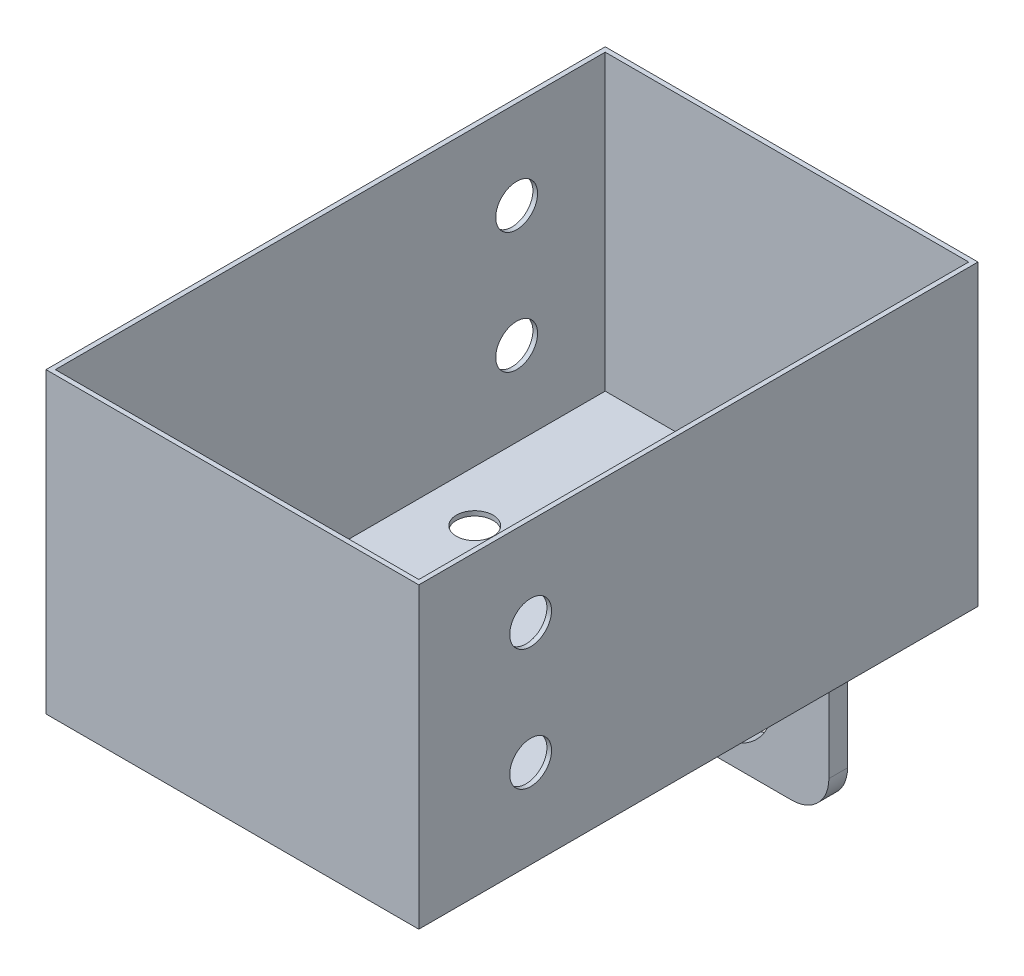
ISO-10303-21;
HEADER;
FILE_DESCRIPTION(('STEP AP214'),'2;1');
FILE_NAME('part.step','',(''),(''),'','','');
FILE_SCHEMA(('AUTOMOTIVE_DESIGN { 1 0 10303 214 1 1 1 1 }'));
ENDSEC;
DATA;
#1=APPLICATION_CONTEXT('core data for automotive mechanical design processes');
#2=APPLICATION_PROTOCOL_DEFINITION('international standard','automotive_design',2000,#1);
#3=PRODUCT_CONTEXT('',#1,'mechanical');
#4=PRODUCT('Part','Part','',(#3));
#5=PRODUCT_RELATED_PRODUCT_CATEGORY('part','',(#4));
#6=PRODUCT_DEFINITION_FORMATION('','',#4);
#7=PRODUCT_DEFINITION_CONTEXT('part definition',#1,'design');
#8=PRODUCT_DEFINITION('design','',#6,#7);
#9=PRODUCT_DEFINITION_SHAPE('','',#8);
#10=(LENGTH_UNIT() NAMED_UNIT(*) SI_UNIT(.MILLI.,.METRE.));
#11=(NAMED_UNIT(*) PLANE_ANGLE_UNIT() SI_UNIT($,.RADIAN.));
#12=(NAMED_UNIT(*) SI_UNIT($,.STERADIAN.) SOLID_ANGLE_UNIT());
#13=UNCERTAINTY_MEASURE_WITH_UNIT(LENGTH_MEASURE(1.E-05),#10,'distance_accuracy_value','');
#14=(GEOMETRIC_REPRESENTATION_CONTEXT(3) GLOBAL_UNCERTAINTY_ASSIGNED_CONTEXT((#13)) GLOBAL_UNIT_ASSIGNED_CONTEXT((#10,
#11,#12)) REPRESENTATION_CONTEXT('',''));
#15=CARTESIAN_POINT('',(0.,0.,0.));
#16=DIRECTION('',(0.,0.,1.));
#17=DIRECTION('',(1.,0.,0.));
#18=AXIS2_PLACEMENT_3D('',#15,#16,#17);
#19=CARTESIAN_POINT('',(0.,0.,0.));
#20=DIRECTION('',(0.,1.,0.));
#21=DIRECTION('',(0.,0.,1.));
#22=AXIS2_PLACEMENT_3D('',#19,#20,#21);
#23=PLANE('',#22);
#24=CARTESIAN_POINT('',(63.5,0.,165.1));
#25=DIRECTION('',(0.,-1.,0.));
#26=DIRECTION('',(0.,0.,-1.));
#27=AXIS2_PLACEMENT_3D('',#24,#25,#26);
#28=CIRCLE('',#27,6.34999999999999);
#29=CARTESIAN_POINT('',(63.5,0.,158.75));
#30=VERTEX_POINT('',#29);
#31=EDGE_CURVE('E366',#30,#30,#28,.T.);
#32=ORIENTED_EDGE('',*,*,#31,.F.);
#33=EDGE_LOOP('',(#32));
#34=FACE_BOUND('',#33,.T.);
#35=CARTESIAN_POINT('',(-88.9,0.,-63.4999999999999));
#36=DIRECTION('',(0.,-1.,0.));
#37=DIRECTION('',(0.,0.,-1.));
#38=AXIS2_PLACEMENT_3D('',#35,#36,#37);
#39=CIRCLE('',#38,12.5);
#40=CARTESIAN_POINT('',(-88.9,0.,-75.9999999999999));
#41=VERTEX_POINT('',#40);
#42=EDGE_CURVE('E376',#41,#41,#39,.T.);
#43=ORIENTED_EDGE('',*,*,#42,.F.);
#44=EDGE_LOOP('',(#43));
#45=FACE_BOUND('',#44,.T.);
#46=CARTESIAN_POINT('',(101.6,0.,-160.02));
#47=DIRECTION('',(0.,-1.,0.));
#48=DIRECTION('',(0.,0.,-1.));
#49=AXIS2_PLACEMENT_3D('',#46,#47,#48);
#50=CIRCLE('',#49,12.5);
#51=CARTESIAN_POINT('',(101.6,0.,-172.52));
#52=VERTEX_POINT('',#51);
#53=EDGE_CURVE('E370',#52,#52,#50,.T.);
#54=ORIENTED_EDGE('',*,*,#53,.F.);
#55=EDGE_LOOP('',(#54));
#56=FACE_BOUND('',#55,.T.);
#57=DIRECTION('',(0.,0.,-1.));
#58=VECTOR('',#57,1.);
#59=CARTESIAN_POINT('',(127.,0.,-190.5));
#60=LINE('',#59,#58);
#61=CARTESIAN_POINT('',(127.,0.,190.5));
#62=VERTEX_POINT('',#61);
#63=CARTESIAN_POINT('',(127.,0.,-190.5));
#64=VERTEX_POINT('',#63);
#65=EDGE_CURVE('E189',#62,#64,#60,.T.);
#66=ORIENTED_EDGE('',*,*,#65,.F.);
#67=DIRECTION('',(1.,0.,0.));
#68=VECTOR('',#67,1.);
#69=CARTESIAN_POINT('',(-127.,0.,190.5));
#70=LINE('',#69,#68);
#71=CARTESIAN_POINT('',(-127.,0.,190.5));
#72=VERTEX_POINT('',#71);
#73=EDGE_CURVE('E182',#72,#62,#70,.T.);
#74=ORIENTED_EDGE('',*,*,#73,.F.);
#75=DIRECTION('',(0.,0.,1.));
#76=VECTOR('',#75,1.);
#77=CARTESIAN_POINT('',(-127.,0.,-190.5));
#78=LINE('',#77,#76);
#79=CARTESIAN_POINT('',(-127.,0.,-190.5));
#80=VERTEX_POINT('',#79);
#81=EDGE_CURVE('E194',#80,#72,#78,.T.);
#82=ORIENTED_EDGE('',*,*,#81,.F.);
#83=DIRECTION('',(-1.,0.,0.));
#84=VECTOR('',#83,1.);
#85=CARTESIAN_POINT('',(-127.,0.,-190.5));
#86=LINE('',#85,#84);
#87=EDGE_CURVE('E192',#64,#80,#86,.T.);
#88=ORIENTED_EDGE('',*,*,#87,.F.);
#89=EDGE_LOOP('',(#66,#74,#82,#88));
#90=FACE_BOUND('',#89,.T.);
#91=DIRECTION('',(0.,0.,-1.));
#92=VECTOR('',#91,1.);
#93=CARTESIAN_POINT('',(-76.2,0.,-152.4));
#94=LINE('',#93,#92);
#95=CARTESIAN_POINT('',(-76.2,0.,-114.3));
#96=VERTEX_POINT('',#95);
#97=CARTESIAN_POINT('',(-76.2,0.,-152.4));
#98=VERTEX_POINT('',#97);
#99=EDGE_CURVE('E49',#96,#98,#94,.T.);
#100=ORIENTED_EDGE('',*,*,#99,.F.);
#101=DIRECTION('',(-1.,0.,0.));
#102=VECTOR('',#101,1.);
#103=CARTESIAN_POINT('',(76.2,0.,-114.3));
#104=LINE('',#103,#102);
#105=CARTESIAN_POINT('',(76.2,0.,-114.3));
#106=VERTEX_POINT('',#105);
#107=EDGE_CURVE('E229',#96,#106,#104,.F.);
#108=ORIENTED_EDGE('',*,*,#107,.T.);
#109=DIRECTION('',(0.,0.,1.));
#110=VECTOR('',#109,1.);
#111=CARTESIAN_POINT('',(76.2,0.,-152.4));
#112=LINE('',#111,#110);
#113=CARTESIAN_POINT('',(76.2,0.,-152.4));
#114=VERTEX_POINT('',#113);
#115=EDGE_CURVE('E56',#114,#106,#112,.T.);
#116=ORIENTED_EDGE('',*,*,#115,.F.);
#117=DIRECTION('',(1.,0.,0.));
#118=VECTOR('',#117,1.);
#119=CARTESIAN_POINT('',(76.2,0.,-152.4));
#120=LINE('',#119,#118);
#121=EDGE_CURVE('E241',#98,#114,#120,.T.);
#122=ORIENTED_EDGE('',*,*,#121,.F.);
#123=EDGE_LOOP('',(#100,#108,#116,#122));
#124=FACE_BOUND('',#123,.T.);
#125=ADVANCED_FACE('F34',(#34,#45,#56,#90,#124),#23,.F.);
#126=CARTESIAN_POINT('',(127.,203.2,-190.5));
#127=DIRECTION('',(-1.,0.,0.));
#128=DIRECTION('',(0.,0.,1.));
#129=AXIS2_PLACEMENT_3D('',#126,#127,#128);
#130=PLANE('',#129);
#131=CARTESIAN_POINT('',(127.,142.875,114.3));
#132=DIRECTION('',(1.,0.,0.));
#133=DIRECTION('',(0.,0.,-1.));
#134=AXIS2_PLACEMENT_3D('',#131,#132,#133);
#135=CIRCLE('',#134,14.25);
#136=CARTESIAN_POINT('',(127.,142.875,100.05));
#137=VERTEX_POINT('',#136);
#138=EDGE_CURVE('E279',#137,#137,#135,.T.);
#139=ORIENTED_EDGE('',*,*,#138,.F.);
#140=EDGE_LOOP('',(#139));
#141=FACE_BOUND('',#140,.T.);
#142=CARTESIAN_POINT('',(127.,60.325,114.3));
#143=DIRECTION('',(1.,0.,0.));
#144=DIRECTION('',(0.,0.,-1.));
#145=AXIS2_PLACEMENT_3D('',#142,#143,#144);
#146=CIRCLE('',#145,14.25);
#147=CARTESIAN_POINT('',(127.,60.325,100.05));
#148=VERTEX_POINT('',#147);
#149=EDGE_CURVE('E280',#148,#148,#146,.T.);
#150=ORIENTED_EDGE('',*,*,#149,.F.);
#151=EDGE_LOOP('',(#150));
#152=FACE_BOUND('',#151,.T.);
#153=ORIENTED_EDGE('',*,*,#65,.T.);
#154=DIRECTION('',(0.,-1.,0.));
#155=VECTOR('',#154,1.);
#156=CARTESIAN_POINT('',(127.,203.2,-190.5));
#157=LINE('',#156,#155);
#158=CARTESIAN_POINT('',(127.,203.2,-190.5));
#159=VERTEX_POINT('',#158);
#160=EDGE_CURVE('E205',#159,#64,#157,.T.);
#161=ORIENTED_EDGE('',*,*,#160,.F.);
#162=DIRECTION('',(0.,0.,-1.));
#163=VECTOR('',#162,1.);
#164=CARTESIAN_POINT('',(127.,203.2,-190.5));
#165=LINE('',#164,#163);
#166=CARTESIAN_POINT('',(127.,203.2,190.5));
#167=VERTEX_POINT('',#166);
#168=EDGE_CURVE('E178',#167,#159,#165,.T.);
#169=ORIENTED_EDGE('',*,*,#168,.F.);
#170=DIRECTION('',(0.,-1.,0.));
#171=VECTOR('',#170,1.);
#172=CARTESIAN_POINT('',(127.,203.2,190.5));
#173=LINE('',#172,#171);
#174=EDGE_CURVE('E188',#167,#62,#173,.T.);
#175=ORIENTED_EDGE('',*,*,#174,.T.);
#176=EDGE_LOOP('',(#153,#161,#169,#175));
#177=FACE_BOUND('',#176,.T.);
#178=ADVANCED_FACE('F309',(#141,#152,#177),#130,.F.);
#179=CARTESIAN_POINT('',(-127.,203.2,-190.5));
#180=DIRECTION('',(0.,0.,1.));
#181=DIRECTION('',(1.,0.,0.));
#182=AXIS2_PLACEMENT_3D('',#179,#180,#181);
#183=PLANE('',#182);
#184=ORIENTED_EDGE('',*,*,#87,.T.);
#185=DIRECTION('',(0.,-1.,0.));
#186=VECTOR('',#185,1.);
#187=CARTESIAN_POINT('',(-127.,203.2,-190.5));
#188=LINE('',#187,#186);
#189=CARTESIAN_POINT('',(-127.,203.2,-190.5));
#190=VERTEX_POINT('',#189);
#191=EDGE_CURVE('E202',#190,#80,#188,.T.);
#192=ORIENTED_EDGE('',*,*,#191,.F.);
#193=DIRECTION('',(-1.,0.,0.));
#194=VECTOR('',#193,1.);
#195=CARTESIAN_POINT('',(-127.,203.2,-190.5));
#196=LINE('',#195,#194);
#197=EDGE_CURVE('E181',#159,#190,#196,.T.);
#198=ORIENTED_EDGE('',*,*,#197,.F.);
#199=ORIENTED_EDGE('',*,*,#160,.T.);
#200=EDGE_LOOP('',(#184,#192,#198,#199));
#201=FACE_BOUND('',#200,.T.);
#202=ADVANCED_FACE('F312',(#201),#183,.F.);
#203=CARTESIAN_POINT('',(-127.,203.2,-190.5));
#204=DIRECTION('',(1.,0.,0.));
#205=DIRECTION('',(0.,0.,-1.));
#206=AXIS2_PLACEMENT_3D('',#203,#204,#205);
#207=PLANE('',#206);
#208=CARTESIAN_POINT('',(-127.,142.875,-127.));
#209=DIRECTION('',(-1.,0.,0.));
#210=DIRECTION('',(0.,0.,1.));
#211=AXIS2_PLACEMENT_3D('',#208,#209,#210);
#212=CIRCLE('',#211,14.25);
#213=CARTESIAN_POINT('',(-127.,142.875,-112.75));
#214=VERTEX_POINT('',#213);
#215=EDGE_CURVE('E264',#214,#214,#212,.T.);
#216=ORIENTED_EDGE('',*,*,#215,.F.);
#217=EDGE_LOOP('',(#216));
#218=FACE_BOUND('',#217,.T.);
#219=CARTESIAN_POINT('',(-127.,60.325,-127.));
#220=DIRECTION('',(-1.,0.,0.));
#221=DIRECTION('',(0.,0.,1.));
#222=AXIS2_PLACEMENT_3D('',#219,#220,#221);
#223=CIRCLE('',#222,14.25);
#224=CARTESIAN_POINT('',(-127.,60.325,-112.75));
#225=VERTEX_POINT('',#224);
#226=EDGE_CURVE('E271',#225,#225,#223,.T.);
#227=ORIENTED_EDGE('',*,*,#226,.F.);
#228=EDGE_LOOP('',(#227));
#229=FACE_BOUND('',#228,.T.);
#230=ORIENTED_EDGE('',*,*,#81,.T.);
#231=DIRECTION('',(0.,-1.,0.));
#232=VECTOR('',#231,1.);
#233=CARTESIAN_POINT('',(-127.,203.2,190.5));
#234=LINE('',#233,#232);
#235=CARTESIAN_POINT('',(-127.,203.2,190.5));
#236=VERTEX_POINT('',#235);
#237=EDGE_CURVE('E199',#236,#72,#234,.T.);
#238=ORIENTED_EDGE('',*,*,#237,.F.);
#239=DIRECTION('',(0.,0.,1.));
#240=VECTOR('',#239,1.);
#241=CARTESIAN_POINT('',(-127.,203.2,-190.5));
#242=LINE('',#241,#240);
#243=EDGE_CURVE('E184',#190,#236,#242,.T.);
#244=ORIENTED_EDGE('',*,*,#243,.F.);
#245=ORIENTED_EDGE('',*,*,#191,.T.);
#246=EDGE_LOOP('',(#230,#238,#244,#245));
#247=FACE_BOUND('',#246,.T.);
#248=ADVANCED_FACE('F317',(#218,#229,#247),#207,.F.);
#249=CARTESIAN_POINT('',(-127.,203.2,190.5));
#250=DIRECTION('',(0.,0.,-1.));
#251=DIRECTION('',(-1.,0.,0.));
#252=AXIS2_PLACEMENT_3D('',#249,#250,#251);
#253=PLANE('',#252);
#254=ORIENTED_EDGE('',*,*,#73,.T.);
#255=ORIENTED_EDGE('',*,*,#174,.F.);
#256=DIRECTION('',(1.,0.,0.));
#257=VECTOR('',#256,1.);
#258=CARTESIAN_POINT('',(-127.,203.2,190.5));
#259=LINE('',#258,#257);
#260=EDGE_CURVE('E186',#236,#167,#259,.T.);
#261=ORIENTED_EDGE('',*,*,#260,.F.);
#262=ORIENTED_EDGE('',*,*,#237,.T.);
#263=EDGE_LOOP('',(#254,#255,#261,#262));
#264=FACE_BOUND('',#263,.T.);
#265=ADVANCED_FACE('F301',(#264),#253,.F.);
#266=CARTESIAN_POINT('',(0.,203.2,0.));
#267=DIRECTION('',(0.,1.,0.));
#268=DIRECTION('',(0.,0.,1.));
#269=AXIS2_PLACEMENT_3D('',#266,#267,#268);
#270=PLANE('',#269);
#271=DIRECTION('',(0.,0.,-1.));
#272=VECTOR('',#271,1.);
#273=CARTESIAN_POINT('',(123.825,203.2,-190.5));
#274=LINE('',#273,#272);
#275=CARTESIAN_POINT('',(123.825,203.2,187.325));
#276=VERTEX_POINT('',#275);
#277=CARTESIAN_POINT('',(123.825,203.2,-187.325));
#278=VERTEX_POINT('',#277);
#279=EDGE_CURVE('E167',#276,#278,#274,.T.);
#280=ORIENTED_EDGE('',*,*,#279,.F.);
#281=DIRECTION('',(1.,0.,0.));
#282=VECTOR('',#281,1.);
#283=CARTESIAN_POINT('',(-127.,203.2,187.325));
#284=LINE('',#283,#282);
#285=CARTESIAN_POINT('',(-123.825,203.2,187.325));
#286=VERTEX_POINT('',#285);
#287=EDGE_CURVE('E176',#286,#276,#284,.T.);
#288=ORIENTED_EDGE('',*,*,#287,.F.);
#289=DIRECTION('',(0.,0.,1.));
#290=VECTOR('',#289,1.);
#291=CARTESIAN_POINT('',(-123.825,203.2,-190.5));
#292=LINE('',#291,#290);
#293=CARTESIAN_POINT('',(-123.825,203.2,-187.325));
#294=VERTEX_POINT('',#293);
#295=EDGE_CURVE('E174',#294,#286,#292,.T.);
#296=ORIENTED_EDGE('',*,*,#295,.F.);
#297=DIRECTION('',(-1.,0.,0.));
#298=VECTOR('',#297,1.);
#299=CARTESIAN_POINT('',(-127.,203.2,-187.325));
#300=LINE('',#299,#298);
#301=EDGE_CURVE('E156',#278,#294,#300,.T.);
#302=ORIENTED_EDGE('',*,*,#301,.F.);
#303=EDGE_LOOP('',(#280,#288,#296,#302));
#304=FACE_BOUND('',#303,.T.);
#305=ORIENTED_EDGE('',*,*,#168,.T.);
#306=ORIENTED_EDGE('',*,*,#197,.T.);
#307=ORIENTED_EDGE('',*,*,#243,.T.);
#308=ORIENTED_EDGE('',*,*,#260,.T.);
#309=EDGE_LOOP('',(#305,#306,#307,#308));
#310=FACE_BOUND('',#309,.T.);
#311=ADVANCED_FACE('F298',(#304,#310),#270,.T.);
#312=CARTESIAN_POINT('',(123.825,203.2,-190.5));
#313=DIRECTION('',(-1.,0.,0.));
#314=DIRECTION('',(0.,0.,1.));
#315=AXIS2_PLACEMENT_3D('',#312,#313,#314);
#316=PLANE('',#315);
#317=CARTESIAN_POINT('',(123.825,142.875,114.3));
#318=DIRECTION('',(-1.,0.,0.));
#319=DIRECTION('',(0.,0.,1.));
#320=AXIS2_PLACEMENT_3D('',#317,#318,#319);
#321=CIRCLE('',#320,14.25);
#322=CARTESIAN_POINT('',(123.825,142.875,128.55));
#323=VERTEX_POINT('',#322);
#324=EDGE_CURVE('E276',#323,#323,#321,.F.);
#325=ORIENTED_EDGE('',*,*,#324,.T.);
#326=EDGE_LOOP('',(#325));
#327=FACE_BOUND('',#326,.T.);
#328=CARTESIAN_POINT('',(123.825,60.325,114.3));
#329=DIRECTION('',(-1.,0.,0.));
#330=DIRECTION('',(0.,0.,1.));
#331=AXIS2_PLACEMENT_3D('',#328,#329,#330);
#332=CIRCLE('',#331,14.25);
#333=CARTESIAN_POINT('',(123.825,60.325,128.55));
#334=VERTEX_POINT('',#333);
#335=EDGE_CURVE('E267',#334,#334,#332,.F.);
#336=ORIENTED_EDGE('',*,*,#335,.T.);
#337=EDGE_LOOP('',(#336));
#338=FACE_BOUND('',#337,.T.);
#339=DIRECTION('',(0.,0.,-1.));
#340=VECTOR('',#339,1.);
#341=CARTESIAN_POINT('',(123.825,3.17500000000001,-190.5));
#342=LINE('',#341,#340);
#343=CARTESIAN_POINT('',(123.825,3.175,187.325));
#344=VERTEX_POINT('',#343);
#345=CARTESIAN_POINT('',(123.825,3.175,-187.325));
#346=VERTEX_POINT('',#345);
#347=EDGE_CURVE('E147',#344,#346,#342,.T.);
#348=ORIENTED_EDGE('',*,*,#347,.F.);
#349=DIRECTION('',(0.,-1.,0.));
#350=VECTOR('',#349,1.);
#351=CARTESIAN_POINT('',(123.825,203.2,187.325));
#352=LINE('',#351,#350);
#353=EDGE_CURVE('E170',#276,#344,#352,.T.);
#354=ORIENTED_EDGE('',*,*,#353,.F.);
#355=ORIENTED_EDGE('',*,*,#279,.T.);
#356=DIRECTION('',(0.,-1.,0.));
#357=VECTOR('',#356,1.);
#358=CARTESIAN_POINT('',(123.825,203.2,-187.325));
#359=LINE('',#358,#357);
#360=EDGE_CURVE('E160',#278,#346,#359,.T.);
#361=ORIENTED_EDGE('',*,*,#360,.T.);
#362=EDGE_LOOP('',(#348,#354,#355,#361));
#363=FACE_BOUND('',#362,.T.);
#364=ADVANCED_FACE('F296',(#327,#338,#363),#316,.T.);
#365=CARTESIAN_POINT('',(-127.,203.2,-187.325));
#366=DIRECTION('',(0.,0.,1.));
#367=DIRECTION('',(1.,0.,0.));
#368=AXIS2_PLACEMENT_3D('',#365,#366,#367);
#369=PLANE('',#368);
#370=DIRECTION('',(-1.,0.,0.));
#371=VECTOR('',#370,1.);
#372=CARTESIAN_POINT('',(-127.,3.17500000000001,-187.325));
#373=LINE('',#372,#371);
#374=CARTESIAN_POINT('',(-123.825,3.175,-187.325));
#375=VERTEX_POINT('',#374);
#376=EDGE_CURVE('E140',#346,#375,#373,.T.);
#377=ORIENTED_EDGE('',*,*,#376,.F.);
#378=ORIENTED_EDGE('',*,*,#360,.F.);
#379=ORIENTED_EDGE('',*,*,#301,.T.);
#380=DIRECTION('',(0.,-1.,0.));
#381=VECTOR('',#380,1.);
#382=CARTESIAN_POINT('',(-123.825,203.2,-187.325));
#383=LINE('',#382,#381);
#384=EDGE_CURVE('E153',#294,#375,#383,.T.);
#385=ORIENTED_EDGE('',*,*,#384,.T.);
#386=EDGE_LOOP('',(#377,#378,#379,#385));
#387=FACE_BOUND('',#386,.T.);
#388=ADVANCED_FACE('F154',(#387),#369,.T.);
#389=CARTESIAN_POINT('',(-123.825,203.2,-190.5));
#390=DIRECTION('',(1.,0.,0.));
#391=DIRECTION('',(0.,0.,-1.));
#392=AXIS2_PLACEMENT_3D('',#389,#390,#391);
#393=PLANE('',#392);
#394=CARTESIAN_POINT('',(-123.825,142.875,-127.));
#395=DIRECTION('',(1.,0.,0.));
#396=DIRECTION('',(0.,0.,-1.));
#397=AXIS2_PLACEMENT_3D('',#394,#395,#396);
#398=CIRCLE('',#397,14.25);
#399=CARTESIAN_POINT('',(-123.825,142.875,-141.25));
#400=VERTEX_POINT('',#399);
#401=EDGE_CURVE('E268',#400,#400,#398,.F.);
#402=ORIENTED_EDGE('',*,*,#401,.T.);
#403=EDGE_LOOP('',(#402));
#404=FACE_BOUND('',#403,.T.);
#405=CARTESIAN_POINT('',(-123.825,60.325,-127.));
#406=DIRECTION('',(1.,0.,0.));
#407=DIRECTION('',(0.,0.,-1.));
#408=AXIS2_PLACEMENT_3D('',#405,#406,#407);
#409=CIRCLE('',#408,14.25);
#410=CARTESIAN_POINT('',(-123.825,60.325,-141.25));
#411=VERTEX_POINT('',#410);
#412=EDGE_CURVE('E263',#411,#411,#409,.F.);
#413=ORIENTED_EDGE('',*,*,#412,.T.);
#414=EDGE_LOOP('',(#413));
#415=FACE_BOUND('',#414,.T.);
#416=DIRECTION('',(0.,0.,1.));
#417=VECTOR('',#416,1.);
#418=CARTESIAN_POINT('',(-123.825,3.17500000000001,-190.5));
#419=LINE('',#418,#417);
#420=CARTESIAN_POINT('',(-123.825,3.175,187.325));
#421=VERTEX_POINT('',#420);
#422=EDGE_CURVE('E144',#375,#421,#419,.T.);
#423=ORIENTED_EDGE('',*,*,#422,.F.);
#424=ORIENTED_EDGE('',*,*,#384,.F.);
#425=ORIENTED_EDGE('',*,*,#295,.T.);
#426=DIRECTION('',(0.,-1.,0.));
#427=VECTOR('',#426,1.);
#428=CARTESIAN_POINT('',(-123.825,203.2,187.325));
#429=LINE('',#428,#427);
#430=EDGE_CURVE('E161',#286,#421,#429,.T.);
#431=ORIENTED_EDGE('',*,*,#430,.T.);
#432=EDGE_LOOP('',(#423,#424,#425,#431));
#433=FACE_BOUND('',#432,.T.);
#434=ADVANCED_FACE('F163',(#404,#415,#433),#393,.T.);
#435=CARTESIAN_POINT('',(-127.,203.2,187.325));
#436=DIRECTION('',(0.,0.,-1.));
#437=DIRECTION('',(-1.,0.,0.));
#438=AXIS2_PLACEMENT_3D('',#435,#436,#437);
#439=PLANE('',#438);
#440=DIRECTION('',(1.,0.,0.));
#441=VECTOR('',#440,1.);
#442=CARTESIAN_POINT('',(-127.,3.17500000000001,187.325));
#443=LINE('',#442,#441);
#444=EDGE_CURVE('E165',#421,#344,#443,.T.);
#445=ORIENTED_EDGE('',*,*,#444,.F.);
#446=ORIENTED_EDGE('',*,*,#430,.F.);
#447=ORIENTED_EDGE('',*,*,#287,.T.);
#448=ORIENTED_EDGE('',*,*,#353,.T.);
#449=EDGE_LOOP('',(#445,#446,#447,#448));
#450=FACE_BOUND('',#449,.T.);
#451=ADVANCED_FACE('F292',(#450),#439,.T.);
#452=CARTESIAN_POINT('',(0.,3.175,0.));
#453=DIRECTION('',(0.,1.,0.));
#454=DIRECTION('',(0.,0.,1.));
#455=AXIS2_PLACEMENT_3D('',#452,#453,#454);
#456=PLANE('',#455);
#457=CARTESIAN_POINT('',(63.5,3.17500000000001,165.1));
#458=DIRECTION('',(0.,1.,0.));
#459=DIRECTION('',(0.,0.,1.));
#460=AXIS2_PLACEMENT_3D('',#457,#458,#459);
#461=CIRCLE('',#460,6.34999999999999);
#462=CARTESIAN_POINT('',(63.5,3.17500000000001,171.45));
#463=VERTEX_POINT('',#462);
#464=EDGE_CURVE('E379',#463,#463,#461,.F.);
#465=ORIENTED_EDGE('',*,*,#464,.T.);
#466=EDGE_LOOP('',(#465));
#467=FACE_BOUND('',#466,.T.);
#468=CARTESIAN_POINT('',(-88.9,3.17500000000001,-63.4999999999999));
#469=DIRECTION('',(0.,1.,0.));
#470=DIRECTION('',(0.,0.,1.));
#471=AXIS2_PLACEMENT_3D('',#468,#469,#470);
#472=CIRCLE('',#471,12.5);
#473=CARTESIAN_POINT('',(-88.9,3.17500000000001,-51.));
#474=VERTEX_POINT('',#473);
#475=EDGE_CURVE('E373',#474,#474,#472,.F.);
#476=ORIENTED_EDGE('',*,*,#475,.T.);
#477=EDGE_LOOP('',(#476));
#478=FACE_BOUND('',#477,.T.);
#479=CARTESIAN_POINT('',(101.6,3.17500000000001,-160.02));
#480=DIRECTION('',(0.,1.,0.));
#481=DIRECTION('',(0.,0.,1.));
#482=AXIS2_PLACEMENT_3D('',#479,#480,#481);
#483=CIRCLE('',#482,12.5);
#484=CARTESIAN_POINT('',(101.6,3.17500000000001,-147.52));
#485=VERTEX_POINT('',#484);
#486=EDGE_CURVE('E367',#485,#485,#483,.F.);
#487=ORIENTED_EDGE('',*,*,#486,.T.);
#488=EDGE_LOOP('',(#487));
#489=FACE_BOUND('',#488,.T.);
#490=ORIENTED_EDGE('',*,*,#347,.T.);
#491=ORIENTED_EDGE('',*,*,#376,.T.);
#492=ORIENTED_EDGE('',*,*,#422,.T.);
#493=ORIENTED_EDGE('',*,*,#444,.T.);
#494=EDGE_LOOP('',(#490,#491,#492,#493));
#495=FACE_BOUND('',#494,.T.);
#496=ADVANCED_FACE('F142',(#467,#478,#489,#495),#456,.T.);
#497=CARTESIAN_POINT('',(-127.001,60.325,114.3));
#498=DIRECTION('',(1.,0.,0.));
#499=DIRECTION('',(0.,0.,-1.));
#500=AXIS2_PLACEMENT_3D('',#497,#498,#499);
#501=CYLINDRICAL_SURFACE('',#500,14.25);
#502=ORIENTED_EDGE('',*,*,#335,.F.);
#503=EDGE_LOOP('',(#502));
#504=FACE_BOUND('',#503,.T.);
#505=ORIENTED_EDGE('',*,*,#149,.T.);
#506=EDGE_LOOP('',(#505));
#507=FACE_BOUND('',#506,.T.);
#508=ADVANCED_FACE('F427',(#504,#507),#501,.F.);
#509=CARTESIAN_POINT('',(-127.001,142.875,114.3));
#510=DIRECTION('',(1.,0.,0.));
#511=DIRECTION('',(0.,0.,-1.));
#512=AXIS2_PLACEMENT_3D('',#509,#510,#511);
#513=CYLINDRICAL_SURFACE('',#512,14.25);
#514=ORIENTED_EDGE('',*,*,#324,.F.);
#515=EDGE_LOOP('',(#514));
#516=FACE_BOUND('',#515,.T.);
#517=ORIENTED_EDGE('',*,*,#138,.T.);
#518=EDGE_LOOP('',(#517));
#519=FACE_BOUND('',#518,.T.);
#520=ADVANCED_FACE('F423',(#516,#519),#513,.F.);
#521=CARTESIAN_POINT('',(127.001,60.325,-127.));
#522=DIRECTION('',(-1.,0.,0.));
#523=DIRECTION('',(0.,0.,1.));
#524=AXIS2_PLACEMENT_3D('',#521,#522,#523);
#525=CYLINDRICAL_SURFACE('',#524,14.25);
#526=ORIENTED_EDGE('',*,*,#412,.F.);
#527=EDGE_LOOP('',(#526));
#528=FACE_BOUND('',#527,.T.);
#529=ORIENTED_EDGE('',*,*,#226,.T.);
#530=EDGE_LOOP('',(#529));
#531=FACE_BOUND('',#530,.T.);
#532=ADVANCED_FACE('F419',(#528,#531),#525,.F.);
#533=CARTESIAN_POINT('',(127.001,142.875,-127.));
#534=DIRECTION('',(-1.,0.,0.));
#535=DIRECTION('',(0.,0.,1.));
#536=AXIS2_PLACEMENT_3D('',#533,#534,#535);
#537=CYLINDRICAL_SURFACE('',#536,14.25);
#538=ORIENTED_EDGE('',*,*,#401,.F.);
#539=EDGE_LOOP('',(#538));
#540=FACE_BOUND('',#539,.T.);
#541=ORIENTED_EDGE('',*,*,#215,.T.);
#542=EDGE_LOOP('',(#541));
#543=FACE_BOUND('',#542,.T.);
#544=ADVANCED_FACE('F416',(#540,#543),#537,.F.);
#545=CARTESIAN_POINT('',(-76.2,-127.,-152.4));
#546=DIRECTION('',(1.,0.,0.));
#547=DIRECTION('',(0.,0.,-1.));
#548=AXIS2_PLACEMENT_3D('',#545,#546,#547);
#549=PLANE('',#548);
#550=DIRECTION('',(0.,1.,0.));
#551=VECTOR('',#550,1.);
#552=CARTESIAN_POINT('',(-76.2,-127.,-152.4));
#553=LINE('',#552,#551);
#554=CARTESIAN_POINT('',(-76.2,-101.6,-152.4));
#555=VERTEX_POINT('',#554);
#556=EDGE_CURVE('E250',#555,#98,#553,.T.);
#557=ORIENTED_EDGE('',*,*,#556,.F.);
#558=DIRECTION('',(0.,0.,-1.));
#559=VECTOR('',#558,1.);
#560=CARTESIAN_POINT('',(-76.2,-101.6,-139.7));
#561=LINE('',#560,#559);
#562=CARTESIAN_POINT('',(-76.2,-101.6,-139.7));
#563=VERTEX_POINT('',#562);
#564=EDGE_CURVE('E218',#555,#563,#561,.F.);
#565=ORIENTED_EDGE('',*,*,#564,.T.);
#566=DIRECTION('',(0.,1.,0.));
#567=VECTOR('',#566,1.);
#568=CARTESIAN_POINT('',(-76.2,-127.,-139.7));
#569=LINE('',#568,#567);
#570=CARTESIAN_POINT('',(-76.2,-25.4,-139.7));
#571=VERTEX_POINT('',#570);
#572=EDGE_CURVE('E236',#563,#571,#569,.T.);
#573=ORIENTED_EDGE('',*,*,#572,.T.);
#574=CARTESIAN_POINT('',(-76.2,-25.4,-114.3));
#575=DIRECTION('',(1.,0.,0.));
#576=DIRECTION('',(0.,0.,-1.));
#577=AXIS2_PLACEMENT_3D('',#574,#575,#576);
#578=CIRCLE('',#577,25.4);
#579=EDGE_CURVE('E42',#571,#96,#578,.T.);
#580=ORIENTED_EDGE('',*,*,#579,.T.);
#581=ORIENTED_EDGE('',*,*,#99,.T.);
#582=EDGE_LOOP('',(#557,#565,#573,#580,#581));
#583=FACE_BOUND('',#582,.T.);
#584=ADVANCED_FACE('F234',(#583),#549,.F.);
#585=CARTESIAN_POINT('',(76.2,-127.,-152.4));
#586=DIRECTION('',(0.,0.,1.));
#587=DIRECTION('',(1.,0.,0.));
#588=AXIS2_PLACEMENT_3D('',#585,#586,#587);
#589=PLANE('',#588);
#590=CARTESIAN_POINT('',(0.,-76.2,-152.4));
#591=DIRECTION('',(0.,0.,-1.));
#592=DIRECTION('',(-1.,0.,0.));
#593=AXIS2_PLACEMENT_3D('',#590,#591,#592);
#594=CIRCLE('',#593,38.1);
#595=CARTESIAN_POINT('',(-38.1,-76.2,-152.4));
#596=VERTEX_POINT('',#595);
#597=EDGE_CURVE('E363',#596,#596,#594,.T.);
#598=ORIENTED_EDGE('',*,*,#597,.F.);
#599=EDGE_LOOP('',(#598));
#600=FACE_BOUND('',#599,.T.);
#601=DIRECTION('',(1.,0.,0.));
#602=VECTOR('',#601,1.);
#603=CARTESIAN_POINT('',(76.2,-127.,-152.4));
#604=LINE('',#603,#602);
#605=CARTESIAN_POINT('',(-50.7999999999999,-127.,-152.4));
#606=VERTEX_POINT('',#605);
#607=CARTESIAN_POINT('',(50.8,-127.,-152.4));
#608=VERTEX_POINT('',#607);
#609=EDGE_CURVE('E242',#606,#608,#604,.T.);
#610=ORIENTED_EDGE('',*,*,#609,.F.);
#611=CARTESIAN_POINT('',(-50.8,-101.6,-152.4));
#612=DIRECTION('',(0.,0.,1.));
#613=DIRECTION('',(1.,0.,0.));
#614=AXIS2_PLACEMENT_3D('',#611,#612,#613);
#615=CIRCLE('',#614,25.4);
#616=EDGE_CURVE('E216',#606,#555,#615,.F.);
#617=ORIENTED_EDGE('',*,*,#616,.T.);
#618=ORIENTED_EDGE('',*,*,#556,.T.);
#619=ORIENTED_EDGE('',*,*,#121,.T.);
#620=DIRECTION('',(0.,1.,0.));
#621=VECTOR('',#620,1.);
#622=CARTESIAN_POINT('',(76.2,-127.,-152.4));
#623=LINE('',#622,#621);
#624=CARTESIAN_POINT('',(76.2,-101.6,-152.4));
#625=VERTEX_POINT('',#624);
#626=EDGE_CURVE('E248',#625,#114,#623,.T.);
#627=ORIENTED_EDGE('',*,*,#626,.F.);
#628=CARTESIAN_POINT('',(50.8,-101.6,-152.4));
#629=DIRECTION('',(0.,0.,1.));
#630=DIRECTION('',(1.,0.,0.));
#631=AXIS2_PLACEMENT_3D('',#628,#629,#630);
#632=CIRCLE('',#631,25.4);
#633=EDGE_CURVE('E214',#625,#608,#632,.F.);
#634=ORIENTED_EDGE('',*,*,#633,.T.);
#635=EDGE_LOOP('',(#610,#617,#618,#619,#627,#634));
#636=FACE_BOUND('',#635,.T.);
#637=ADVANCED_FACE('F247',(#600,#636),#589,.F.);
#638=CARTESIAN_POINT('',(76.2,-127.,-152.4));
#639=DIRECTION('',(-1.,0.,0.));
#640=DIRECTION('',(0.,0.,1.));
#641=AXIS2_PLACEMENT_3D('',#638,#639,#640);
#642=PLANE('',#641);
#643=DIRECTION('',(0.,1.,0.));
#644=VECTOR('',#643,1.);
#645=CARTESIAN_POINT('',(76.2,-127.,-139.7));
#646=LINE('',#645,#644);
#647=CARTESIAN_POINT('',(76.2,-101.6,-139.7));
#648=VERTEX_POINT('',#647);
#649=CARTESIAN_POINT('',(76.2,-25.4,-139.7));
#650=VERTEX_POINT('',#649);
#651=EDGE_CURVE('E257',#648,#650,#646,.T.);
#652=ORIENTED_EDGE('',*,*,#651,.F.);
#653=DIRECTION('',(0.,0.,1.));
#654=VECTOR('',#653,1.);
#655=CARTESIAN_POINT('',(76.2,-101.6,-152.4));
#656=LINE('',#655,#654);
#657=EDGE_CURVE('E224',#648,#625,#656,.F.);
#658=ORIENTED_EDGE('',*,*,#657,.T.);
#659=ORIENTED_EDGE('',*,*,#626,.T.);
#660=ORIENTED_EDGE('',*,*,#115,.T.);
#661=CARTESIAN_POINT('',(76.2,-25.4,-114.3));
#662=DIRECTION('',(-1.,0.,0.));
#663=DIRECTION('',(0.,0.,1.));
#664=AXIS2_PLACEMENT_3D('',#661,#662,#663);
#665=CIRCLE('',#664,25.4);
#666=EDGE_CURVE('E11',#106,#650,#665,.T.);
#667=ORIENTED_EDGE('',*,*,#666,.T.);
#668=EDGE_LOOP('',(#652,#658,#659,#660,#667));
#669=FACE_BOUND('',#668,.T.);
#670=ADVANCED_FACE('F407',(#669),#642,.F.);
#671=CARTESIAN_POINT('',(76.2,-127.,-139.7));
#672=DIRECTION('',(0.,0.,-1.));
#673=DIRECTION('',(-1.,0.,0.));
#674=AXIS2_PLACEMENT_3D('',#671,#672,#673);
#675=PLANE('',#674);
#676=CARTESIAN_POINT('',(0.,-76.2,-139.7));
#677=DIRECTION('',(0.,0.,-1.));
#678=DIRECTION('',(-1.,0.,0.));
#679=AXIS2_PLACEMENT_3D('',#676,#677,#678);
#680=CIRCLE('',#679,38.1);
#681=CARTESIAN_POINT('',(-38.1,-76.2,-139.7));
#682=VERTEX_POINT('',#681);
#683=EDGE_CURVE('E252',#682,#682,#680,.F.);
#684=ORIENTED_EDGE('',*,*,#683,.F.);
#685=EDGE_LOOP('',(#684));
#686=FACE_BOUND('',#685,.T.);
#687=ORIENTED_EDGE('',*,*,#651,.T.);
#688=DIRECTION('',(-1.,0.,0.));
#689=VECTOR('',#688,1.);
#690=CARTESIAN_POINT('',(-76.2,-25.4,-139.7));
#691=LINE('',#690,#689);
#692=EDGE_CURVE('E226',#650,#571,#691,.T.);
#693=ORIENTED_EDGE('',*,*,#692,.T.);
#694=ORIENTED_EDGE('',*,*,#572,.F.);
#695=CARTESIAN_POINT('',(-50.8,-101.6,-139.7));
#696=DIRECTION('',(0.,0.,-1.));
#697=DIRECTION('',(-1.,0.,0.));
#698=AXIS2_PLACEMENT_3D('',#695,#696,#697);
#699=CIRCLE('',#698,25.4);
#700=CARTESIAN_POINT('',(-50.7999999999999,-127.,-139.7));
#701=VERTEX_POINT('',#700);
#702=EDGE_CURVE('E222',#563,#701,#699,.F.);
#703=ORIENTED_EDGE('',*,*,#702,.T.);
#704=DIRECTION('',(-1.,0.,0.));
#705=VECTOR('',#704,1.);
#706=CARTESIAN_POINT('',(76.2,-127.,-139.7));
#707=LINE('',#706,#705);
#708=CARTESIAN_POINT('',(50.8,-127.,-139.7));
#709=VERTEX_POINT('',#708);
#710=EDGE_CURVE('E258',#709,#701,#707,.T.);
#711=ORIENTED_EDGE('',*,*,#710,.F.);
#712=CARTESIAN_POINT('',(50.8,-101.6,-139.7));
#713=DIRECTION('',(0.,0.,-1.));
#714=DIRECTION('',(-1.,0.,0.));
#715=AXIS2_PLACEMENT_3D('',#712,#713,#714);
#716=CIRCLE('',#715,25.4);
#717=EDGE_CURVE('E220',#709,#648,#716,.F.);
#718=ORIENTED_EDGE('',*,*,#717,.T.);
#719=EDGE_LOOP('',(#687,#693,#694,#703,#711,#718));
#720=FACE_BOUND('',#719,.T.);
#721=ADVANCED_FACE('F404',(#686,#720),#675,.F.);
#722=CARTESIAN_POINT('',(0.,-127.,0.));
#723=DIRECTION('',(0.,-1.,0.));
#724=DIRECTION('',(0.,0.,-1.));
#725=AXIS2_PLACEMENT_3D('',#722,#723,#724);
#726=PLANE('',#725);
#727=ORIENTED_EDGE('',*,*,#710,.T.);
#728=DIRECTION('',(0.,0.,-1.));
#729=VECTOR('',#728,1.);
#730=CARTESIAN_POINT('',(-50.8,-127.,-152.4));
#731=LINE('',#730,#729);
#732=EDGE_CURVE('E211',#701,#606,#731,.T.);
#733=ORIENTED_EDGE('',*,*,#732,.T.);
#734=ORIENTED_EDGE('',*,*,#609,.T.);
#735=DIRECTION('',(0.,0.,1.));
#736=VECTOR('',#735,1.);
#737=CARTESIAN_POINT('',(50.8,-127.,-139.7));
#738=LINE('',#737,#736);
#739=EDGE_CURVE('E208',#608,#709,#738,.T.);
#740=ORIENTED_EDGE('',*,*,#739,.T.);
#741=EDGE_LOOP('',(#727,#733,#734,#740));
#742=FACE_BOUND('',#741,.T.);
#743=ADVANCED_FACE('F356',(#742),#726,.T.);
#744=CARTESIAN_POINT('',(0.,-76.2,190.501));
#745=DIRECTION('',(0.,0.,-1.));
#746=DIRECTION('',(-1.,0.,0.));
#747=AXIS2_PLACEMENT_3D('',#744,#745,#746);
#748=CYLINDRICAL_SURFACE('',#747,38.1);
#749=ORIENTED_EDGE('',*,*,#597,.T.);
#750=EDGE_LOOP('',(#749));
#751=FACE_BOUND('',#750,.T.);
#752=ORIENTED_EDGE('',*,*,#683,.T.);
#753=EDGE_LOOP('',(#752));
#754=FACE_BOUND('',#753,.T.);
#755=ADVANCED_FACE('F343',(#751,#754),#748,.F.);
#756=CARTESIAN_POINT('',(-50.8,-101.6,0.));
#757=DIRECTION('',(0.,0.,1.));
#758=DIRECTION('',(1.,0.,0.));
#759=AXIS2_PLACEMENT_3D('',#756,#757,#758);
#760=CYLINDRICAL_SURFACE('',#759,25.4);
#761=ORIENTED_EDGE('',*,*,#702,.F.);
#762=ORIENTED_EDGE('',*,*,#564,.F.);
#763=ORIENTED_EDGE('',*,*,#616,.F.);
#764=ORIENTED_EDGE('',*,*,#732,.F.);
#765=EDGE_LOOP('',(#761,#762,#763,#764));
#766=FACE_BOUND('',#765,.T.);
#767=ADVANCED_FACE('F340',(#766),#760,.T.);
#768=CARTESIAN_POINT('',(50.8,-101.6,0.));
#769=DIRECTION('',(0.,0.,-1.));
#770=DIRECTION('',(-1.,0.,0.));
#771=AXIS2_PLACEMENT_3D('',#768,#769,#770);
#772=CYLINDRICAL_SURFACE('',#771,25.4);
#773=ORIENTED_EDGE('',*,*,#633,.F.);
#774=ORIENTED_EDGE('',*,*,#657,.F.);
#775=ORIENTED_EDGE('',*,*,#717,.F.);
#776=ORIENTED_EDGE('',*,*,#739,.F.);
#777=EDGE_LOOP('',(#773,#774,#775,#776));
#778=FACE_BOUND('',#777,.T.);
#779=ADVANCED_FACE('F342',(#778),#772,.T.);
#780=CARTESIAN_POINT('',(76.2,-25.4,-114.3));
#781=DIRECTION('',(1.,0.,0.));
#782=DIRECTION('',(0.,0.,-1.));
#783=AXIS2_PLACEMENT_3D('',#780,#781,#782);
#784=CYLINDRICAL_SURFACE('',#783,25.4);
#785=ORIENTED_EDGE('',*,*,#666,.F.);
#786=ORIENTED_EDGE('',*,*,#107,.F.);
#787=ORIENTED_EDGE('',*,*,#579,.F.);
#788=ORIENTED_EDGE('',*,*,#692,.F.);
#789=EDGE_LOOP('',(#785,#786,#787,#788));
#790=FACE_BOUND('',#789,.T.);
#791=ADVANCED_FACE('F36',(#790),#784,.F.);
#792=CARTESIAN_POINT('',(101.6,203.201,-160.02));
#793=DIRECTION('',(0.,-1.,0.));
#794=DIRECTION('',(0.,0.,-1.));
#795=AXIS2_PLACEMENT_3D('',#792,#793,#794);
#796=CYLINDRICAL_SURFACE('',#795,12.5);
#797=ORIENTED_EDGE('',*,*,#486,.F.);
#798=EDGE_LOOP('',(#797));
#799=FACE_BOUND('',#798,.T.);
#800=ORIENTED_EDGE('',*,*,#53,.T.);
#801=EDGE_LOOP('',(#800));
#802=FACE_BOUND('',#801,.T.);
#803=ADVANCED_FACE('F350',(#799,#802),#796,.F.);
#804=CARTESIAN_POINT('',(-88.9,203.201,-63.4999999999999));
#805=DIRECTION('',(0.,-1.,0.));
#806=DIRECTION('',(0.,0.,-1.));
#807=AXIS2_PLACEMENT_3D('',#804,#805,#806);
#808=CYLINDRICAL_SURFACE('',#807,12.5);
#809=ORIENTED_EDGE('',*,*,#475,.F.);
#810=EDGE_LOOP('',(#809));
#811=FACE_BOUND('',#810,.T.);
#812=ORIENTED_EDGE('',*,*,#42,.T.);
#813=EDGE_LOOP('',(#812));
#814=FACE_BOUND('',#813,.T.);
#815=ADVANCED_FACE('F386',(#811,#814),#808,.F.);
#816=CARTESIAN_POINT('',(63.5,203.201,165.1));
#817=DIRECTION('',(0.,-1.,0.));
#818=DIRECTION('',(0.,0.,-1.));
#819=AXIS2_PLACEMENT_3D('',#816,#817,#818);
#820=CYLINDRICAL_SURFACE('',#819,6.34999999999999);
#821=ORIENTED_EDGE('',*,*,#464,.F.);
#822=EDGE_LOOP('',(#821));
#823=FACE_BOUND('',#822,.T.);
#824=ORIENTED_EDGE('',*,*,#31,.T.);
#825=EDGE_LOOP('',(#824));
#826=FACE_BOUND('',#825,.T.);
#827=ADVANCED_FACE('F384',(#823,#826),#820,.F.);
#828=CLOSED_SHELL('',(#125,#178,#202,#248,#265,#311,#364,#388,#434,#451,#496,#508,#520,#532,
#544,#584,#637,#670,#721,#743,#755,#767,#779,#791,#803,#815,#827));
#829=MANIFOLD_SOLID_BREP('B2',#828);
#830=ADVANCED_BREP_SHAPE_REPRESENTATION('',(#18,#829),#14);
#831=SHAPE_DEFINITION_REPRESENTATION(#9,#830);
ENDSEC;
END-ISO-10303-21;
